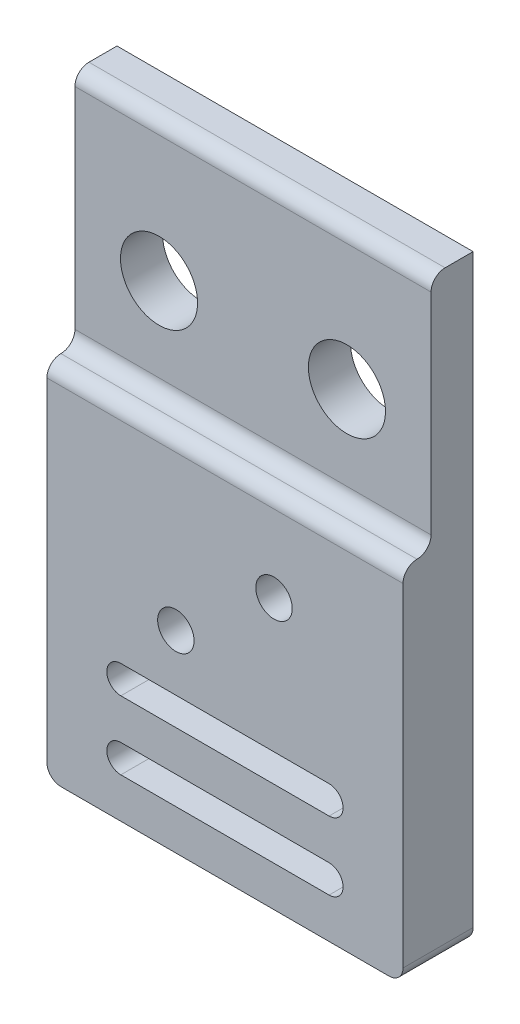
ISO-10303-21;
HEADER;
FILE_DESCRIPTION(('STEP AP214'),'2;1');
FILE_NAME('part.step','',(''),(''),'','','');
FILE_SCHEMA(('AUTOMOTIVE_DESIGN { 1 0 10303 214 1 1 1 1 }'));
ENDSEC;
DATA;
#1=APPLICATION_CONTEXT('core data for automotive mechanical design processes');
#2=APPLICATION_PROTOCOL_DEFINITION('international standard','automotive_design',2000,#1);
#3=PRODUCT_CONTEXT('',#1,'mechanical');
#4=PRODUCT('Part','Part','',(#3));
#5=PRODUCT_RELATED_PRODUCT_CATEGORY('part','',(#4));
#6=PRODUCT_DEFINITION_FORMATION('','',#4);
#7=PRODUCT_DEFINITION_CONTEXT('part definition',#1,'design');
#8=PRODUCT_DEFINITION('design','',#6,#7);
#9=PRODUCT_DEFINITION_SHAPE('','',#8);
#10=(LENGTH_UNIT() NAMED_UNIT(*) SI_UNIT(.MILLI.,.METRE.));
#11=(NAMED_UNIT(*) PLANE_ANGLE_UNIT() SI_UNIT($,.RADIAN.));
#12=(NAMED_UNIT(*) SI_UNIT($,.STERADIAN.) SOLID_ANGLE_UNIT());
#13=UNCERTAINTY_MEASURE_WITH_UNIT(LENGTH_MEASURE(1.E-05),#10,'distance_accuracy_value','');
#14=(GEOMETRIC_REPRESENTATION_CONTEXT(3) GLOBAL_UNCERTAINTY_ASSIGNED_CONTEXT((#13)) GLOBAL_UNIT_ASSIGNED_CONTEXT((#10,
#11,#12)) REPRESENTATION_CONTEXT('',''));
#15=CARTESIAN_POINT('',(0.,0.,0.));
#16=DIRECTION('',(0.,0.,1.));
#17=DIRECTION('',(1.,0.,0.));
#18=AXIS2_PLACEMENT_3D('',#15,#16,#17);
#19=CARTESIAN_POINT('',(0.,0.,3.));
#20=DIRECTION('',(0.,0.,-1.));
#21=DIRECTION('',(-1.,0.,0.));
#22=AXIS2_PLACEMENT_3D('',#19,#20,#21);
#23=PLANE('',#22);
#24=CARTESIAN_POINT('',(-6.7,0.,3.));
#25=DIRECTION('',(0.,0.,1.));
#26=DIRECTION('',(-1.,0.,0.));
#27=AXIS2_PLACEMENT_3D('',#24,#25,#26);
#28=CIRCLE('',#27,2.75);
#29=CARTESIAN_POINT('',(-9.45,0.,3.));
#30=VERTEX_POINT('',#29);
#31=EDGE_CURVE('E257',#30,#30,#28,.T.);
#32=ORIENTED_EDGE('',*,*,#31,.F.);
#33=EDGE_LOOP('',(#32));
#34=FACE_BOUND('',#33,.T.);
#35=CARTESIAN_POINT('',(6.7,0.,3.));
#36=DIRECTION('',(0.,0.,1.));
#37=DIRECTION('',(1.,0.,0.));
#38=AXIS2_PLACEMENT_3D('',#35,#36,#37);
#39=CIRCLE('',#38,2.75);
#40=CARTESIAN_POINT('',(9.45,0.,3.));
#41=VERTEX_POINT('',#40);
#42=EDGE_CURVE('E263',#41,#41,#39,.T.);
#43=ORIENTED_EDGE('',*,*,#42,.F.);
#44=EDGE_LOOP('',(#43));
#45=FACE_BOUND('',#44,.T.);
#46=DIRECTION('',(0.,1.,0.));
#47=VECTOR('',#46,1.);
#48=CARTESIAN_POINT('',(12.7,-10.,3.));
#49=LINE('',#48,#47);
#50=CARTESIAN_POINT('',(12.7,-6.,3.));
#51=VERTEX_POINT('',#50);
#52=CARTESIAN_POINT('',(12.7,9.,3.));
#53=VERTEX_POINT('',#52);
#54=EDGE_CURVE('E269',#51,#53,#49,.T.);
#55=ORIENTED_EDGE('',*,*,#54,.T.);
#56=DIRECTION('',(-1.,0.,0.));
#57=VECTOR('',#56,1.);
#58=CARTESIAN_POINT('',(0.,9.,3.));
#59=LINE('',#58,#57);
#60=CARTESIAN_POINT('',(-12.7,9.,3.));
#61=VERTEX_POINT('',#60);
#62=EDGE_CURVE('E372',#53,#61,#59,.T.);
#63=ORIENTED_EDGE('',*,*,#62,.T.);
#64=DIRECTION('',(0.,-1.,0.));
#65=VECTOR('',#64,1.);
#66=CARTESIAN_POINT('',(-12.7,-10.,3.));
#67=LINE('',#66,#65);
#68=CARTESIAN_POINT('',(-12.7,-6.,3.));
#69=VERTEX_POINT('',#68);
#70=EDGE_CURVE('E272',#61,#69,#67,.T.);
#71=ORIENTED_EDGE('',*,*,#70,.T.);
#72=DIRECTION('',(-1.,0.,0.));
#73=VECTOR('',#72,1.);
#74=CARTESIAN_POINT('',(12.7,-6.,3.));
#75=LINE('',#74,#73);
#76=EDGE_CURVE('E370',#69,#51,#75,.F.);
#77=ORIENTED_EDGE('',*,*,#76,.T.);
#78=EDGE_LOOP('',(#55,#63,#71,#77));
#79=FACE_BOUND('',#78,.T.);
#80=ADVANCED_FACE('F32',(#34,#45,#79),#23,.F.);
#81=CARTESIAN_POINT('',(0.,0.,0.));
#82=DIRECTION('',(0.,0.,-1.));
#83=DIRECTION('',(-1.,0.,0.));
#84=AXIS2_PLACEMENT_3D('',#81,#82,#83);
#85=PLANE('',#84);
#86=DIRECTION('',(1.,0.,0.));
#87=VECTOR('',#86,1.);
#88=CARTESIAN_POINT('',(0.,-30.8808034620421,0.));
#89=LINE('',#88,#87);
#90=CARTESIAN_POINT('',(-7.42600909266542,-30.8808034620421,0.));
#91=VERTEX_POINT('',#90);
#92=CARTESIAN_POINT('',(7.42600909266543,-30.8808034620421,0.));
#93=VERTEX_POINT('',#92);
#94=EDGE_CURVE('E299',#91,#93,#89,.T.);
#95=ORIENTED_EDGE('',*,*,#94,.T.);
#96=CARTESIAN_POINT('',(7.42600909266543,-28.8808034620421,0.));
#97=DIRECTION('',(0.,0.,-1.));
#98=DIRECTION('',(-1.,0.,0.));
#99=AXIS2_PLACEMENT_3D('',#96,#97,#98);
#100=CIRCLE('',#99,2.00000000000001);
#101=CARTESIAN_POINT('',(7.42600909266543,-26.8808034620421,0.));
#102=VERTEX_POINT('',#101);
#103=EDGE_CURVE('E301',#93,#102,#100,.F.);
#104=ORIENTED_EDGE('',*,*,#103,.T.);
#105=DIRECTION('',(-1.,0.,0.));
#106=VECTOR('',#105,1.);
#107=CARTESIAN_POINT('',(0.,-26.8808034620421,0.));
#108=LINE('',#107,#106);
#109=CARTESIAN_POINT('',(-7.42600909266542,-26.8808034620421,0.));
#110=VERTEX_POINT('',#109);
#111=EDGE_CURVE('E295',#102,#110,#108,.T.);
#112=ORIENTED_EDGE('',*,*,#111,.T.);
#113=CARTESIAN_POINT('',(-7.42600909266542,-28.8808034620421,0.));
#114=DIRECTION('',(0.,0.,-1.));
#115=DIRECTION('',(-1.,0.,0.));
#116=AXIS2_PLACEMENT_3D('',#113,#114,#115);
#117=CIRCLE('',#116,2.00000000000001);
#118=EDGE_CURVE('E297',#110,#91,#117,.F.);
#119=ORIENTED_EDGE('',*,*,#118,.T.);
#120=EDGE_LOOP('',(#95,#104,#112,#119));
#121=FACE_BOUND('',#120,.T.);
#122=DIRECTION('',(-1.,0.,0.));
#123=VECTOR('',#122,1.);
#124=CARTESIAN_POINT('',(0.,-22.,0.));
#125=LINE('',#124,#123);
#126=CARTESIAN_POINT('',(7.42600909266543,-22.,0.));
#127=VERTEX_POINT('',#126);
#128=CARTESIAN_POINT('',(-7.42600909266543,-22.,0.));
#129=VERTEX_POINT('',#128);
#130=EDGE_CURVE('E290',#127,#129,#125,.T.);
#131=ORIENTED_EDGE('',*,*,#130,.T.);
#132=CARTESIAN_POINT('',(-7.42600909266543,-24.,0.));
#133=DIRECTION('',(0.,0.,-1.));
#134=DIRECTION('',(-1.,0.,0.));
#135=AXIS2_PLACEMENT_3D('',#132,#133,#134);
#136=CIRCLE('',#135,2.);
#137=CARTESIAN_POINT('',(-7.42600909266543,-26.,0.));
#138=VERTEX_POINT('',#137);
#139=EDGE_CURVE('E292',#129,#138,#136,.F.);
#140=ORIENTED_EDGE('',*,*,#139,.T.);
#141=DIRECTION('',(1.,0.,0.));
#142=VECTOR('',#141,1.);
#143=CARTESIAN_POINT('',(0.,-26.,0.));
#144=LINE('',#143,#142);
#145=CARTESIAN_POINT('',(7.42600909266543,-26.,0.));
#146=VERTEX_POINT('',#145);
#147=EDGE_CURVE('E286',#138,#146,#144,.T.);
#148=ORIENTED_EDGE('',*,*,#147,.T.);
#149=CARTESIAN_POINT('',(7.42600909266543,-24.,0.));
#150=DIRECTION('',(0.,0.,-1.));
#151=DIRECTION('',(-1.,0.,0.));
#152=AXIS2_PLACEMENT_3D('',#149,#150,#151);
#153=CIRCLE('',#152,2.);
#154=EDGE_CURVE('E288',#146,#127,#153,.F.);
#155=ORIENTED_EDGE('',*,*,#154,.T.);
#156=EDGE_LOOP('',(#131,#140,#148,#155));
#157=FACE_BOUND('',#156,.T.);
#158=DIRECTION('',(0.,1.,0.));
#159=VECTOR('',#158,1.);
#160=CARTESIAN_POINT('',(12.7,-10.,0.));
#161=LINE('',#160,#159);
#162=CARTESIAN_POINT('',(12.7,-31.75,0.));
#163=VERTEX_POINT('',#162);
#164=CARTESIAN_POINT('',(12.7,10.,0.));
#165=VERTEX_POINT('',#164);
#166=EDGE_CURVE('E266',#163,#165,#161,.T.);
#167=ORIENTED_EDGE('',*,*,#166,.F.);
#168=CARTESIAN_POINT('',(11.7,-31.75,0.));
#169=DIRECTION('',(0.,0.,-1.));
#170=DIRECTION('',(-1.,0.,0.));
#171=AXIS2_PLACEMENT_3D('',#168,#169,#170);
#172=CIRCLE('',#171,1.);
#173=CARTESIAN_POINT('',(11.7,-32.75,0.));
#174=VERTEX_POINT('',#173);
#175=EDGE_CURVE('E351',#163,#174,#172,.T.);
#176=ORIENTED_EDGE('',*,*,#175,.T.);
#177=DIRECTION('',(1.,0.,0.));
#178=VECTOR('',#177,1.);
#179=CARTESIAN_POINT('',(-12.7,-32.75,0.));
#180=LINE('',#179,#178);
#181=CARTESIAN_POINT('',(-11.7,-32.75,0.));
#182=VERTEX_POINT('',#181);
#183=EDGE_CURVE('E242',#182,#174,#180,.T.);
#184=ORIENTED_EDGE('',*,*,#183,.F.);
#185=CARTESIAN_POINT('',(-11.7,-31.75,0.));
#186=DIRECTION('',(0.,0.,-1.));
#187=DIRECTION('',(-1.,0.,0.));
#188=AXIS2_PLACEMENT_3D('',#185,#186,#187);
#189=CIRCLE('',#188,1.);
#190=CARTESIAN_POINT('',(-12.7,-31.75,0.));
#191=VERTEX_POINT('',#190);
#192=EDGE_CURVE('E349',#182,#191,#189,.T.);
#193=ORIENTED_EDGE('',*,*,#192,.T.);
#194=DIRECTION('',(0.,-1.,0.));
#195=VECTOR('',#194,1.);
#196=CARTESIAN_POINT('',(-12.7,-10.,0.));
#197=LINE('',#196,#195);
#198=CARTESIAN_POINT('',(-12.7,10.,0.));
#199=VERTEX_POINT('',#198);
#200=EDGE_CURVE('E273',#199,#191,#197,.T.);
#201=ORIENTED_EDGE('',*,*,#200,.F.);
#202=DIRECTION('',(-1.,0.,0.));
#203=VECTOR('',#202,1.);
#204=CARTESIAN_POINT('',(-12.7,10.,0.));
#205=LINE('',#204,#203);
#206=EDGE_CURVE('E278',#165,#199,#205,.T.);
#207=ORIENTED_EDGE('',*,*,#206,.F.);
#208=EDGE_LOOP('',(#167,#176,#184,#193,#201,#207));
#209=FACE_BOUND('',#208,.T.);
#210=CARTESIAN_POINT('',(-3.5,-19.,0.));
#211=DIRECTION('',(0.,0.,1.));
#212=DIRECTION('',(1.,0.,0.));
#213=AXIS2_PLACEMENT_3D('',#210,#211,#212);
#214=CIRCLE('',#213,1.3);
#215=CARTESIAN_POINT('',(-2.2,-19.,0.));
#216=VERTEX_POINT('',#215);
#217=EDGE_CURVE('E238',#216,#216,#214,.T.);
#218=ORIENTED_EDGE('',*,*,#217,.T.);
#219=EDGE_LOOP('',(#218));
#220=FACE_BOUND('',#219,.T.);
#221=CARTESIAN_POINT('',(3.5,-13.5,0.));
#222=DIRECTION('',(0.,0.,1.));
#223=DIRECTION('',(1.,0.,0.));
#224=AXIS2_PLACEMENT_3D('',#221,#222,#223);
#225=CIRCLE('',#224,1.3);
#226=CARTESIAN_POINT('',(4.8,-13.5,0.));
#227=VERTEX_POINT('',#226);
#228=EDGE_CURVE('E333',#227,#227,#225,.T.);
#229=ORIENTED_EDGE('',*,*,#228,.T.);
#230=EDGE_LOOP('',(#229));
#231=FACE_BOUND('',#230,.T.);
#232=CARTESIAN_POINT('',(6.7,0.,0.));
#233=DIRECTION('',(0.,0.,1.));
#234=DIRECTION('',(1.,0.,0.));
#235=AXIS2_PLACEMENT_3D('',#232,#233,#234);
#236=CIRCLE('',#235,2.75);
#237=CARTESIAN_POINT('',(9.45,0.,0.));
#238=VERTEX_POINT('',#237);
#239=EDGE_CURVE('E260',#238,#238,#236,.T.);
#240=ORIENTED_EDGE('',*,*,#239,.T.);
#241=EDGE_LOOP('',(#240));
#242=FACE_BOUND('',#241,.T.);
#243=CARTESIAN_POINT('',(-6.7,0.,0.));
#244=DIRECTION('',(0.,0.,1.));
#245=DIRECTION('',(-1.,0.,0.));
#246=AXIS2_PLACEMENT_3D('',#243,#244,#245);
#247=CIRCLE('',#246,2.75);
#248=CARTESIAN_POINT('',(-9.45,0.,0.));
#249=VERTEX_POINT('',#248);
#250=EDGE_CURVE('E254',#249,#249,#247,.T.);
#251=ORIENTED_EDGE('',*,*,#250,.T.);
#252=EDGE_LOOP('',(#251));
#253=FACE_BOUND('',#252,.T.);
#254=ADVANCED_FACE('F409',(#121,#157,#209,#220,#231,#242,#253),#85,.T.);
#255=CARTESIAN_POINT('',(12.7,-10.,3.));
#256=DIRECTION('',(-1.,0.,0.));
#257=DIRECTION('',(0.,0.,1.));
#258=AXIS2_PLACEMENT_3D('',#255,#256,#257);
#259=PLANE('',#258);
#260=DIRECTION('',(0.,1.,0.));
#261=VECTOR('',#260,1.);
#262=CARTESIAN_POINT('',(12.7,-7.,5.));
#263=LINE('',#262,#261);
#264=CARTESIAN_POINT('',(12.7,-31.75,5.));
#265=VERTEX_POINT('',#264);
#266=CARTESIAN_POINT('',(12.7,-8.,5.));
#267=VERTEX_POINT('',#266);
#268=EDGE_CURVE('E251',#265,#267,#263,.T.);
#269=ORIENTED_EDGE('',*,*,#268,.F.);
#270=DIRECTION('',(0.,0.,-1.));
#271=VECTOR('',#270,1.);
#272=CARTESIAN_POINT('',(12.7,-31.75,3.));
#273=LINE('',#272,#271);
#274=EDGE_CURVE('E346',#265,#163,#273,.T.);
#275=ORIENTED_EDGE('',*,*,#274,.T.);
#276=ORIENTED_EDGE('',*,*,#166,.T.);
#277=DIRECTION('',(0.,0.,-1.));
#278=VECTOR('',#277,1.);
#279=CARTESIAN_POINT('',(12.7,10.,3.));
#280=LINE('',#279,#278);
#281=CARTESIAN_POINT('',(12.7,10.,2.));
#282=VERTEX_POINT('',#281);
#283=EDGE_CURVE('E284',#282,#165,#280,.T.);
#284=ORIENTED_EDGE('',*,*,#283,.F.);
#285=CARTESIAN_POINT('',(12.7,9.,2.));
#286=DIRECTION('',(-1.,0.,0.));
#287=DIRECTION('',(0.,0.,1.));
#288=AXIS2_PLACEMENT_3D('',#285,#286,#287);
#289=CIRCLE('',#288,1.);
#290=EDGE_CURVE('E344',#282,#53,#289,.F.);
#291=ORIENTED_EDGE('',*,*,#290,.T.);
#292=ORIENTED_EDGE('',*,*,#54,.F.);
#293=CARTESIAN_POINT('',(12.7,-6.,4.));
#294=DIRECTION('',(-1.,0.,0.));
#295=DIRECTION('',(0.,0.,1.));
#296=AXIS2_PLACEMENT_3D('',#293,#294,#295);
#297=CIRCLE('',#296,1.);
#298=CARTESIAN_POINT('',(12.7,-7.,4.));
#299=VERTEX_POINT('',#298);
#300=EDGE_CURVE('E11',#51,#299,#297,.T.);
#301=ORIENTED_EDGE('',*,*,#300,.T.);
#302=CARTESIAN_POINT('',(12.7,-8.,4.));
#303=DIRECTION('',(-1.,0.,0.));
#304=DIRECTION('',(0.,0.,1.));
#305=AXIS2_PLACEMENT_3D('',#302,#303,#304);
#306=CIRCLE('',#305,1.);
#307=EDGE_CURVE('E321',#299,#267,#306,.F.);
#308=ORIENTED_EDGE('',*,*,#307,.T.);
#309=EDGE_LOOP('',(#269,#275,#276,#284,#291,#292,#301,#308));
#310=FACE_BOUND('',#309,.T.);
#311=ADVANCED_FACE('F385',(#310),#259,.F.);
#312=CARTESIAN_POINT('',(-12.7,10.,3.));
#313=DIRECTION('',(0.,-1.,0.));
#314=DIRECTION('',(0.,0.,-1.));
#315=AXIS2_PLACEMENT_3D('',#312,#313,#314);
#316=PLANE('',#315);
#317=DIRECTION('',(0.,0.,-1.));
#318=VECTOR('',#317,1.);
#319=CARTESIAN_POINT('',(-12.7,10.,3.));
#320=LINE('',#319,#318);
#321=CARTESIAN_POINT('',(-12.7,10.,2.));
#322=VERTEX_POINT('',#321);
#323=EDGE_CURVE('E275',#322,#199,#320,.T.);
#324=ORIENTED_EDGE('',*,*,#323,.F.);
#325=DIRECTION('',(-1.,0.,0.));
#326=VECTOR('',#325,1.);
#327=CARTESIAN_POINT('',(-12.7,10.,2.));
#328=LINE('',#327,#326);
#329=EDGE_CURVE('E375',#322,#282,#328,.F.);
#330=ORIENTED_EDGE('',*,*,#329,.T.);
#331=ORIENTED_EDGE('',*,*,#283,.T.);
#332=ORIENTED_EDGE('',*,*,#206,.T.);
#333=EDGE_LOOP('',(#324,#330,#331,#332));
#334=FACE_BOUND('',#333,.T.);
#335=ADVANCED_FACE('F380',(#334),#316,.F.);
#336=CARTESIAN_POINT('',(-12.7,-10.,3.));
#337=DIRECTION('',(1.,0.,0.));
#338=DIRECTION('',(0.,0.,-1.));
#339=AXIS2_PLACEMENT_3D('',#336,#337,#338);
#340=PLANE('',#339);
#341=ORIENTED_EDGE('',*,*,#200,.T.);
#342=DIRECTION('',(0.,0.,-1.));
#343=VECTOR('',#342,1.);
#344=CARTESIAN_POINT('',(-12.7,-31.75,3.));
#345=LINE('',#344,#343);
#346=CARTESIAN_POINT('',(-12.7,-31.75,5.));
#347=VERTEX_POINT('',#346);
#348=EDGE_CURVE('E368',#191,#347,#345,.F.);
#349=ORIENTED_EDGE('',*,*,#348,.T.);
#350=DIRECTION('',(0.,-1.,0.));
#351=VECTOR('',#350,1.);
#352=CARTESIAN_POINT('',(-12.7,-7.,5.));
#353=LINE('',#352,#351);
#354=CARTESIAN_POINT('',(-12.7,-8.,5.));
#355=VERTEX_POINT('',#354);
#356=EDGE_CURVE('E245',#355,#347,#353,.T.);
#357=ORIENTED_EDGE('',*,*,#356,.F.);
#358=CARTESIAN_POINT('',(-12.7,-8.,4.));
#359=DIRECTION('',(1.,0.,0.));
#360=DIRECTION('',(0.,0.,-1.));
#361=AXIS2_PLACEMENT_3D('',#358,#359,#360);
#362=CIRCLE('',#361,1.);
#363=CARTESIAN_POINT('',(-12.7,-7.,4.));
#364=VERTEX_POINT('',#363);
#365=EDGE_CURVE('E365',#355,#364,#362,.F.);
#366=ORIENTED_EDGE('',*,*,#365,.T.);
#367=CARTESIAN_POINT('',(-12.7,-6.,4.));
#368=DIRECTION('',(1.,0.,0.));
#369=DIRECTION('',(0.,0.,-1.));
#370=AXIS2_PLACEMENT_3D('',#367,#368,#369);
#371=CIRCLE('',#370,1.);
#372=EDGE_CURVE('E41',#364,#69,#371,.T.);
#373=ORIENTED_EDGE('',*,*,#372,.T.);
#374=ORIENTED_EDGE('',*,*,#70,.F.);
#375=CARTESIAN_POINT('',(-12.7,9.,2.));
#376=DIRECTION('',(1.,0.,0.));
#377=DIRECTION('',(0.,0.,-1.));
#378=AXIS2_PLACEMENT_3D('',#375,#376,#377);
#379=CIRCLE('',#378,1.);
#380=EDGE_CURVE('E48',#61,#322,#379,.F.);
#381=ORIENTED_EDGE('',*,*,#380,.T.);
#382=ORIENTED_EDGE('',*,*,#323,.T.);
#383=EDGE_LOOP('',(#341,#349,#357,#366,#373,#374,#381,#382));
#384=FACE_BOUND('',#383,.T.);
#385=ADVANCED_FACE('F393',(#384),#340,.F.);
#386=CARTESIAN_POINT('',(6.7,0.,3.));
#387=DIRECTION('',(0.,0.,-1.));
#388=DIRECTION('',(-1.,0.,0.));
#389=AXIS2_PLACEMENT_3D('',#386,#387,#388);
#390=CYLINDRICAL_SURFACE('',#389,2.75);
#391=ORIENTED_EDGE('',*,*,#42,.T.);
#392=EDGE_LOOP('',(#391));
#393=FACE_BOUND('',#392,.T.);
#394=ORIENTED_EDGE('',*,*,#239,.F.);
#395=EDGE_LOOP('',(#394));
#396=FACE_BOUND('',#395,.T.);
#397=ADVANCED_FACE('F397',(#393,#396),#390,.F.);
#398=CARTESIAN_POINT('',(-6.7,0.,3.));
#399=DIRECTION('',(0.,0.,-1.));
#400=DIRECTION('',(-1.,0.,0.));
#401=AXIS2_PLACEMENT_3D('',#398,#399,#400);
#402=CYLINDRICAL_SURFACE('',#401,2.75);
#403=ORIENTED_EDGE('',*,*,#31,.T.);
#404=EDGE_LOOP('',(#403));
#405=FACE_BOUND('',#404,.T.);
#406=ORIENTED_EDGE('',*,*,#250,.F.);
#407=EDGE_LOOP('',(#406));
#408=FACE_BOUND('',#407,.T.);
#409=ADVANCED_FACE('F403',(#405,#408),#402,.F.);
#410=CARTESIAN_POINT('',(0.,0.,5.));
#411=DIRECTION('',(0.,0.,1.));
#412=DIRECTION('',(1.,0.,0.));
#413=AXIS2_PLACEMENT_3D('',#410,#411,#412);
#414=PLANE('',#413);
#415=DIRECTION('',(1.,0.,0.));
#416=VECTOR('',#415,1.);
#417=CARTESIAN_POINT('',(-7.42600909266542,-29.8808034620421,5.));
#418=LINE('',#417,#416);
#419=CARTESIAN_POINT('',(-7.42600909266542,-29.8808034620421,5.));
#420=VERTEX_POINT('',#419);
#421=CARTESIAN_POINT('',(7.42600909266543,-29.8808034620421,5.));
#422=VERTEX_POINT('',#421);
#423=EDGE_CURVE('E190',#420,#422,#418,.T.);
#424=ORIENTED_EDGE('',*,*,#423,.F.);
#425=CARTESIAN_POINT('',(-7.42600909266542,-28.8808034620421,5.));
#426=DIRECTION('',(0.,0.,1.));
#427=DIRECTION('',(-1.,0.,0.));
#428=AXIS2_PLACEMENT_3D('',#425,#426,#427);
#429=CIRCLE('',#428,1.00000000000001);
#430=CARTESIAN_POINT('',(-7.42600909266542,-27.8808034620421,5.));
#431=VERTEX_POINT('',#430);
#432=EDGE_CURVE('E180',#431,#420,#429,.T.);
#433=ORIENTED_EDGE('',*,*,#432,.F.);
#434=DIRECTION('',(-1.,0.,0.));
#435=VECTOR('',#434,1.);
#436=CARTESIAN_POINT('',(-7.42600909266542,-27.8808034620421,5.));
#437=LINE('',#436,#435);
#438=CARTESIAN_POINT('',(7.42600909266543,-27.8808034620421,5.));
#439=VERTEX_POINT('',#438);
#440=EDGE_CURVE('E208',#439,#431,#437,.T.);
#441=ORIENTED_EDGE('',*,*,#440,.F.);
#442=CARTESIAN_POINT('',(7.42600909266543,-28.8808034620421,5.));
#443=DIRECTION('',(0.,0.,1.));
#444=DIRECTION('',(-1.,0.,0.));
#445=AXIS2_PLACEMENT_3D('',#442,#443,#444);
#446=CIRCLE('',#445,1.00000000000001);
#447=EDGE_CURVE('E206',#422,#439,#446,.T.);
#448=ORIENTED_EDGE('',*,*,#447,.F.);
#449=EDGE_LOOP('',(#424,#433,#441,#448));
#450=FACE_BOUND('',#449,.T.);
#451=DIRECTION('',(1.,0.,0.));
#452=VECTOR('',#451,1.);
#453=CARTESIAN_POINT('',(-7.42600909266543,-25.,5.));
#454=LINE('',#453,#452);
#455=CARTESIAN_POINT('',(-7.42600909266543,-25.,5.));
#456=VERTEX_POINT('',#455);
#457=CARTESIAN_POINT('',(7.42600909266543,-25.,5.));
#458=VERTEX_POINT('',#457);
#459=EDGE_CURVE('E219',#456,#458,#454,.T.);
#460=ORIENTED_EDGE('',*,*,#459,.F.);
#461=CARTESIAN_POINT('',(-7.42600909266543,-24.,5.));
#462=DIRECTION('',(0.,0.,1.));
#463=DIRECTION('',(1.,0.,0.));
#464=AXIS2_PLACEMENT_3D('',#461,#462,#463);
#465=CIRCLE('',#464,1.);
#466=CARTESIAN_POINT('',(-7.42600909266543,-23.,5.));
#467=VERTEX_POINT('',#466);
#468=EDGE_CURVE('E199',#467,#456,#465,.T.);
#469=ORIENTED_EDGE('',*,*,#468,.F.);
#470=DIRECTION('',(-1.,0.,0.));
#471=VECTOR('',#470,1.);
#472=CARTESIAN_POINT('',(-7.42600909266543,-23.,5.));
#473=LINE('',#472,#471);
#474=CARTESIAN_POINT('',(7.42600909266543,-23.,5.));
#475=VERTEX_POINT('',#474);
#476=EDGE_CURVE('E224',#475,#467,#473,.T.);
#477=ORIENTED_EDGE('',*,*,#476,.F.);
#478=CARTESIAN_POINT('',(7.42600909266543,-24.,5.));
#479=DIRECTION('',(0.,0.,1.));
#480=DIRECTION('',(1.,0.,0.));
#481=AXIS2_PLACEMENT_3D('',#478,#479,#480);
#482=CIRCLE('',#481,1.);
#483=EDGE_CURVE('E221',#458,#475,#482,.T.);
#484=ORIENTED_EDGE('',*,*,#483,.F.);
#485=EDGE_LOOP('',(#460,#469,#477,#484));
#486=FACE_BOUND('',#485,.T.);
#487=CARTESIAN_POINT('',(-3.5,-19.,5.));
#488=DIRECTION('',(0.,0.,1.));
#489=DIRECTION('',(1.,0.,0.));
#490=AXIS2_PLACEMENT_3D('',#487,#488,#489);
#491=CIRCLE('',#490,1.3);
#492=CARTESIAN_POINT('',(-2.2,-19.,5.));
#493=VERTEX_POINT('',#492);
#494=EDGE_CURVE('E239',#493,#493,#491,.T.);
#495=ORIENTED_EDGE('',*,*,#494,.F.);
#496=EDGE_LOOP('',(#495));
#497=FACE_BOUND('',#496,.T.);
#498=DIRECTION('',(1.,0.,0.));
#499=VECTOR('',#498,1.);
#500=CARTESIAN_POINT('',(-12.7,-32.75,5.));
#501=LINE('',#500,#499);
#502=CARTESIAN_POINT('',(-11.7,-32.75,5.));
#503=VERTEX_POINT('',#502);
#504=CARTESIAN_POINT('',(11.7,-32.75,5.));
#505=VERTEX_POINT('',#504);
#506=EDGE_CURVE('E248',#503,#505,#501,.T.);
#507=ORIENTED_EDGE('',*,*,#506,.T.);
#508=CARTESIAN_POINT('',(11.7,-31.75,5.));
#509=DIRECTION('',(0.,0.,1.));
#510=DIRECTION('',(1.,0.,0.));
#511=AXIS2_PLACEMENT_3D('',#508,#509,#510);
#512=CIRCLE('',#511,1.);
#513=EDGE_CURVE('E363',#505,#265,#512,.T.);
#514=ORIENTED_EDGE('',*,*,#513,.T.);
#515=ORIENTED_EDGE('',*,*,#268,.T.);
#516=DIRECTION('',(-1.,0.,0.));
#517=VECTOR('',#516,1.);
#518=CARTESIAN_POINT('',(-12.7,-8.,5.));
#519=LINE('',#518,#517);
#520=EDGE_CURVE('E358',#267,#355,#519,.T.);
#521=ORIENTED_EDGE('',*,*,#520,.T.);
#522=ORIENTED_EDGE('',*,*,#356,.T.);
#523=CARTESIAN_POINT('',(-11.7,-31.75,5.));
#524=DIRECTION('',(0.,0.,1.));
#525=DIRECTION('',(1.,0.,0.));
#526=AXIS2_PLACEMENT_3D('',#523,#524,#525);
#527=CIRCLE('',#526,1.);
#528=EDGE_CURVE('E361',#347,#503,#527,.T.);
#529=ORIENTED_EDGE('',*,*,#528,.T.);
#530=EDGE_LOOP('',(#507,#514,#515,#521,#522,#529));
#531=FACE_BOUND('',#530,.T.);
#532=CARTESIAN_POINT('',(3.5,-13.5,5.));
#533=DIRECTION('',(0.,0.,1.));
#534=DIRECTION('',(1.,0.,0.));
#535=AXIS2_PLACEMENT_3D('',#532,#533,#534);
#536=CIRCLE('',#535,1.3);
#537=CARTESIAN_POINT('',(4.8,-13.5,5.));
#538=VERTEX_POINT('',#537);
#539=EDGE_CURVE('E191',#538,#538,#536,.T.);
#540=ORIENTED_EDGE('',*,*,#539,.F.);
#541=EDGE_LOOP('',(#540));
#542=FACE_BOUND('',#541,.T.);
#543=ADVANCED_FACE('F203',(#450,#486,#497,#531,#542),#414,.T.);
#544=CARTESIAN_POINT('',(-12.7,-32.75,5.));
#545=DIRECTION('',(0.,1.,0.));
#546=DIRECTION('',(0.,0.,1.));
#547=AXIS2_PLACEMENT_3D('',#544,#545,#546);
#548=PLANE('',#547);
#549=ORIENTED_EDGE('',*,*,#183,.T.);
#550=DIRECTION('',(0.,0.,-1.));
#551=VECTOR('',#550,1.);
#552=CARTESIAN_POINT('',(11.7,-32.75,5.));
#553=LINE('',#552,#551);
#554=EDGE_CURVE('E356',#174,#505,#553,.F.);
#555=ORIENTED_EDGE('',*,*,#554,.T.);
#556=ORIENTED_EDGE('',*,*,#506,.F.);
#557=DIRECTION('',(0.,0.,-1.));
#558=VECTOR('',#557,1.);
#559=CARTESIAN_POINT('',(-11.7,-32.75,5.));
#560=LINE('',#559,#558);
#561=EDGE_CURVE('E353',#503,#182,#560,.T.);
#562=ORIENTED_EDGE('',*,*,#561,.T.);
#563=EDGE_LOOP('',(#549,#555,#556,#562));
#564=FACE_BOUND('',#563,.T.);
#565=ADVANCED_FACE('F422',(#564),#548,.F.);
#566=CARTESIAN_POINT('',(-3.5,-19.,5.));
#567=DIRECTION('',(0.,0.,-1.));
#568=DIRECTION('',(-1.,0.,0.));
#569=AXIS2_PLACEMENT_3D('',#566,#567,#568);
#570=CYLINDRICAL_SURFACE('',#569,1.3);
#571=ORIENTED_EDGE('',*,*,#494,.T.);
#572=EDGE_LOOP('',(#571));
#573=FACE_BOUND('',#572,.T.);
#574=ORIENTED_EDGE('',*,*,#217,.F.);
#575=EDGE_LOOP('',(#574));
#576=FACE_BOUND('',#575,.T.);
#577=ADVANCED_FACE('F425',(#573,#576),#570,.F.);
#578=CARTESIAN_POINT('',(-7.42600909266543,-24.,5.));
#579=DIRECTION('',(0.,0.,-1.));
#580=DIRECTION('',(-1.,0.,0.));
#581=AXIS2_PLACEMENT_3D('',#578,#579,#580);
#582=CYLINDRICAL_SURFACE('',#581,1.);
#583=DIRECTION('',(0.,0.,-1.));
#584=VECTOR('',#583,1.);
#585=CARTESIAN_POINT('',(-7.42600909266543,-25.,5.));
#586=LINE('',#585,#584);
#587=CARTESIAN_POINT('',(-7.42600909266543,-25.,1.));
#588=VERTEX_POINT('',#587);
#589=EDGE_CURVE('E235',#456,#588,#586,.T.);
#590=ORIENTED_EDGE('',*,*,#589,.T.);
#591=CARTESIAN_POINT('',(-7.42600909266543,-24.,1.));
#592=DIRECTION('',(0.,0.,-1.));
#593=DIRECTION('',(-1.,0.,0.));
#594=AXIS2_PLACEMENT_3D('',#591,#592,#593);
#595=CIRCLE('',#594,1.);
#596=CARTESIAN_POINT('',(-7.42600909266543,-23.,1.));
#597=VERTEX_POINT('',#596);
#598=EDGE_CURVE('E310',#588,#597,#595,.T.);
#599=ORIENTED_EDGE('',*,*,#598,.T.);
#600=DIRECTION('',(0.,0.,-1.));
#601=VECTOR('',#600,1.);
#602=CARTESIAN_POINT('',(-7.42600909266543,-23.,5.));
#603=LINE('',#602,#601);
#604=EDGE_CURVE('E226',#467,#597,#603,.T.);
#605=ORIENTED_EDGE('',*,*,#604,.F.);
#606=ORIENTED_EDGE('',*,*,#468,.T.);
#607=EDGE_LOOP('',(#590,#599,#605,#606));
#608=FACE_BOUND('',#607,.T.);
#609=ADVANCED_FACE('F431',(#608),#582,.F.);
#610=CARTESIAN_POINT('',(-7.42600909266543,-25.,5.));
#611=DIRECTION('',(0.,1.,0.));
#612=DIRECTION('',(-1.,0.,0.));
#613=AXIS2_PLACEMENT_3D('',#610,#611,#612);
#614=PLANE('',#613);
#615=DIRECTION('',(0.,0.,-1.));
#616=VECTOR('',#615,1.);
#617=CARTESIAN_POINT('',(7.42600909266543,-25.,5.));
#618=LINE('',#617,#616);
#619=CARTESIAN_POINT('',(7.42600909266543,-25.,1.));
#620=VERTEX_POINT('',#619);
#621=EDGE_CURVE('E232',#458,#620,#618,.T.);
#622=ORIENTED_EDGE('',*,*,#621,.T.);
#623=DIRECTION('',(1.,0.,0.));
#624=VECTOR('',#623,1.);
#625=CARTESIAN_POINT('',(-7.42600909266543,-25.,1.));
#626=LINE('',#625,#624);
#627=EDGE_CURVE('E319',#620,#588,#626,.F.);
#628=ORIENTED_EDGE('',*,*,#627,.T.);
#629=ORIENTED_EDGE('',*,*,#589,.F.);
#630=ORIENTED_EDGE('',*,*,#459,.T.);
#631=EDGE_LOOP('',(#622,#628,#629,#630));
#632=FACE_BOUND('',#631,.T.);
#633=ADVANCED_FACE('F435',(#632),#614,.T.);
#634=CARTESIAN_POINT('',(7.42600909266543,-24.,5.));
#635=DIRECTION('',(0.,0.,-1.));
#636=DIRECTION('',(-1.,0.,0.));
#637=AXIS2_PLACEMENT_3D('',#634,#635,#636);
#638=CYLINDRICAL_SURFACE('',#637,1.);
#639=DIRECTION('',(0.,0.,-1.));
#640=VECTOR('',#639,1.);
#641=CARTESIAN_POINT('',(7.42600909266543,-23.,5.));
#642=LINE('',#641,#640);
#643=CARTESIAN_POINT('',(7.42600909266543,-23.,1.));
#644=VERTEX_POINT('',#643);
#645=EDGE_CURVE('E229',#475,#644,#642,.T.);
#646=ORIENTED_EDGE('',*,*,#645,.T.);
#647=CARTESIAN_POINT('',(7.42600909266543,-24.,1.));
#648=DIRECTION('',(0.,0.,-1.));
#649=DIRECTION('',(-1.,0.,0.));
#650=AXIS2_PLACEMENT_3D('',#647,#648,#649);
#651=CIRCLE('',#650,1.);
#652=EDGE_CURVE('E315',#644,#620,#651,.T.);
#653=ORIENTED_EDGE('',*,*,#652,.T.);
#654=ORIENTED_EDGE('',*,*,#621,.F.);
#655=ORIENTED_EDGE('',*,*,#483,.T.);
#656=EDGE_LOOP('',(#646,#653,#654,#655));
#657=FACE_BOUND('',#656,.T.);
#658=ADVANCED_FACE('F439',(#657),#638,.F.);
#659=CARTESIAN_POINT('',(-7.42600909266543,-23.,5.));
#660=DIRECTION('',(0.,-1.,0.));
#661=DIRECTION('',(1.,0.,0.));
#662=AXIS2_PLACEMENT_3D('',#659,#660,#661);
#663=PLANE('',#662);
#664=ORIENTED_EDGE('',*,*,#604,.T.);
#665=DIRECTION('',(-1.,0.,0.));
#666=VECTOR('',#665,1.);
#667=CARTESIAN_POINT('',(-7.42600909266543,-23.,1.));
#668=LINE('',#667,#666);
#669=EDGE_CURVE('E313',#597,#644,#668,.F.);
#670=ORIENTED_EDGE('',*,*,#669,.T.);
#671=ORIENTED_EDGE('',*,*,#645,.F.);
#672=ORIENTED_EDGE('',*,*,#476,.T.);
#673=EDGE_LOOP('',(#664,#670,#671,#672));
#674=FACE_BOUND('',#673,.T.);
#675=ADVANCED_FACE('F443',(#674),#663,.T.);
#676=CARTESIAN_POINT('',(-7.42600909266542,-28.8808034620421,5.));
#677=DIRECTION('',(0.,0.,-1.));
#678=DIRECTION('',(-1.,0.,0.));
#679=AXIS2_PLACEMENT_3D('',#676,#677,#678);
#680=CYLINDRICAL_SURFACE('',#679,1.00000000000001);
#681=DIRECTION('',(0.,0.,-1.));
#682=VECTOR('',#681,1.);
#683=CARTESIAN_POINT('',(-7.42600909266542,-29.8808034620421,5.));
#684=LINE('',#683,#682);
#685=CARTESIAN_POINT('',(-7.42600909266542,-29.8808034620421,1.));
#686=VERTEX_POINT('',#685);
#687=EDGE_CURVE('E183',#420,#686,#684,.T.);
#688=ORIENTED_EDGE('',*,*,#687,.T.);
#689=CARTESIAN_POINT('',(-7.42600909266542,-28.8808034620421,1.));
#690=DIRECTION('',(0.,0.,-1.));
#691=DIRECTION('',(-1.,0.,0.));
#692=AXIS2_PLACEMENT_3D('',#689,#690,#691);
#693=CIRCLE('',#692,1.00000000000001);
#694=CARTESIAN_POINT('',(-7.42600909266542,-27.8808034620421,1.));
#695=VERTEX_POINT('',#694);
#696=EDGE_CURVE('E308',#686,#695,#693,.T.);
#697=ORIENTED_EDGE('',*,*,#696,.T.);
#698=DIRECTION('',(0.,0.,-1.));
#699=VECTOR('',#698,1.);
#700=CARTESIAN_POINT('',(-7.42600909266542,-27.8808034620421,5.));
#701=LINE('',#700,#699);
#702=EDGE_CURVE('E186',#431,#695,#701,.T.);
#703=ORIENTED_EDGE('',*,*,#702,.F.);
#704=ORIENTED_EDGE('',*,*,#432,.T.);
#705=EDGE_LOOP('',(#688,#697,#703,#704));
#706=FACE_BOUND('',#705,.T.);
#707=ADVANCED_FACE('F182',(#706),#680,.F.);
#708=CARTESIAN_POINT('',(-7.42600909266542,-29.8808034620421,5.));
#709=DIRECTION('',(0.,1.,0.));
#710=DIRECTION('',(-1.,0.,0.));
#711=AXIS2_PLACEMENT_3D('',#708,#709,#710);
#712=PLANE('',#711);
#713=DIRECTION('',(0.,0.,-1.));
#714=VECTOR('',#713,1.);
#715=CARTESIAN_POINT('',(7.42600909266543,-29.8808034620421,5.));
#716=LINE('',#715,#714);
#717=CARTESIAN_POINT('',(7.42600909266543,-29.8808034620421,1.));
#718=VERTEX_POINT('',#717);
#719=EDGE_CURVE('E200',#422,#718,#716,.T.);
#720=ORIENTED_EDGE('',*,*,#719,.T.);
#721=DIRECTION('',(1.,0.,0.));
#722=VECTOR('',#721,1.);
#723=CARTESIAN_POINT('',(-7.42600909266542,-29.8808034620421,1.));
#724=LINE('',#723,#722);
#725=EDGE_CURVE('E198',#718,#686,#724,.F.);
#726=ORIENTED_EDGE('',*,*,#725,.T.);
#727=ORIENTED_EDGE('',*,*,#687,.F.);
#728=ORIENTED_EDGE('',*,*,#423,.T.);
#729=EDGE_LOOP('',(#720,#726,#727,#728));
#730=FACE_BOUND('',#729,.T.);
#731=ADVANCED_FACE('F195',(#730),#712,.T.);
#732=CARTESIAN_POINT('',(7.42600909266543,-28.8808034620421,5.));
#733=DIRECTION('',(0.,0.,-1.));
#734=DIRECTION('',(-1.,0.,0.));
#735=AXIS2_PLACEMENT_3D('',#732,#733,#734);
#736=CYLINDRICAL_SURFACE('',#735,1.00000000000001);
#737=DIRECTION('',(0.,0.,-1.));
#738=VECTOR('',#737,1.);
#739=CARTESIAN_POINT('',(7.42600909266543,-27.8808034620421,5.));
#740=LINE('',#739,#738);
#741=CARTESIAN_POINT('',(7.42600909266543,-27.8808034620421,1.));
#742=VERTEX_POINT('',#741);
#743=EDGE_CURVE('E214',#439,#742,#740,.T.);
#744=ORIENTED_EDGE('',*,*,#743,.T.);
#745=CARTESIAN_POINT('',(7.42600909266543,-28.8808034620421,1.));
#746=DIRECTION('',(0.,0.,-1.));
#747=DIRECTION('',(-1.,0.,0.));
#748=AXIS2_PLACEMENT_3D('',#745,#746,#747);
#749=CIRCLE('',#748,1.00000000000001);
#750=EDGE_CURVE('E304',#742,#718,#749,.T.);
#751=ORIENTED_EDGE('',*,*,#750,.T.);
#752=ORIENTED_EDGE('',*,*,#719,.F.);
#753=ORIENTED_EDGE('',*,*,#447,.T.);
#754=EDGE_LOOP('',(#744,#751,#752,#753));
#755=FACE_BOUND('',#754,.T.);
#756=ADVANCED_FACE('F452',(#755),#736,.F.);
#757=CARTESIAN_POINT('',(-7.42600909266542,-27.8808034620421,5.));
#758=DIRECTION('',(0.,-1.,0.));
#759=DIRECTION('',(1.,0.,0.));
#760=AXIS2_PLACEMENT_3D('',#757,#758,#759);
#761=PLANE('',#760);
#762=ORIENTED_EDGE('',*,*,#702,.T.);
#763=DIRECTION('',(-1.,0.,0.));
#764=VECTOR('',#763,1.);
#765=CARTESIAN_POINT('',(-7.42600909266542,-27.8808034620421,1.));
#766=LINE('',#765,#764);
#767=EDGE_CURVE('E317',#695,#742,#766,.F.);
#768=ORIENTED_EDGE('',*,*,#767,.T.);
#769=ORIENTED_EDGE('',*,*,#743,.F.);
#770=ORIENTED_EDGE('',*,*,#440,.T.);
#771=EDGE_LOOP('',(#762,#768,#769,#770));
#772=FACE_BOUND('',#771,.T.);
#773=ADVANCED_FACE('F455',(#772),#761,.T.);
#774=CARTESIAN_POINT('',(3.5,-13.5,5.));
#775=DIRECTION('',(0.,0.,-1.));
#776=DIRECTION('',(-1.,0.,0.));
#777=AXIS2_PLACEMENT_3D('',#774,#775,#776);
#778=CYLINDRICAL_SURFACE('',#777,1.3);
#779=ORIENTED_EDGE('',*,*,#539,.T.);
#780=EDGE_LOOP('',(#779));
#781=FACE_BOUND('',#780,.T.);
#782=ORIENTED_EDGE('',*,*,#228,.F.);
#783=EDGE_LOOP('',(#782));
#784=FACE_BOUND('',#783,.T.);
#785=ADVANCED_FACE('F459',(#781,#784),#778,.F.);
#786=CARTESIAN_POINT('',(-7.42600909266542,-28.8808034620421,1.));
#787=DIRECTION('',(0.,0.,-1.));
#788=DIRECTION('',(-1.,0.,0.));
#789=AXIS2_PLACEMENT_3D('',#786,#787,#788);
#790=TOROIDAL_SURFACE('',#789,2.00000000000001,1.);
#791=CARTESIAN_POINT('',(-7.42600909266542,-26.8808034620421,1.));
#792=DIRECTION('',(1.,0.,0.));
#793=DIRECTION('',(0.,0.,-1.));
#794=AXIS2_PLACEMENT_3D('',#791,#792,#793);
#795=CIRCLE('',#794,1.);
#796=EDGE_CURVE('E327',#695,#110,#795,.T.);
#797=ORIENTED_EDGE('',*,*,#796,.F.);
#798=ORIENTED_EDGE('',*,*,#696,.F.);
#799=CARTESIAN_POINT('',(-7.42600909266542,-30.8808034620421,1.));
#800=DIRECTION('',(1.,0.,0.));
#801=DIRECTION('',(0.,0.,-1.));
#802=AXIS2_PLACEMENT_3D('',#799,#800,#801);
#803=CIRCLE('',#802,1.);
#804=EDGE_CURVE('E330',#91,#686,#803,.T.);
#805=ORIENTED_EDGE('',*,*,#804,.F.);
#806=ORIENTED_EDGE('',*,*,#118,.F.);
#807=EDGE_LOOP('',(#797,#798,#805,#806));
#808=FACE_BOUND('',#807,.T.);
#809=ADVANCED_FACE('F462',(#808),#790,.T.);
#810=CARTESIAN_POINT('',(0.,-30.8808034620421,1.));
#811=DIRECTION('',(1.,0.,0.));
#812=DIRECTION('',(0.,1.,0.));
#813=AXIS2_PLACEMENT_3D('',#810,#811,#812);
#814=CYLINDRICAL_SURFACE('',#813,1.);
#815=ORIENTED_EDGE('',*,*,#804,.T.);
#816=ORIENTED_EDGE('',*,*,#725,.F.);
#817=CARTESIAN_POINT('',(7.42600909266543,-30.8808034620421,1.));
#818=DIRECTION('',(1.,0.,0.));
#819=DIRECTION('',(0.,0.,-1.));
#820=AXIS2_PLACEMENT_3D('',#817,#818,#819);
#821=CIRCLE('',#820,1.);
#822=EDGE_CURVE('E324',#93,#718,#821,.T.);
#823=ORIENTED_EDGE('',*,*,#822,.F.);
#824=ORIENTED_EDGE('',*,*,#94,.F.);
#825=EDGE_LOOP('',(#815,#816,#823,#824));
#826=FACE_BOUND('',#825,.T.);
#827=ADVANCED_FACE('F467',(#826),#814,.T.);
#828=CARTESIAN_POINT('',(0.,-26.8808034620421,1.));
#829=DIRECTION('',(-1.,0.,0.));
#830=DIRECTION('',(0.,-1.,0.));
#831=AXIS2_PLACEMENT_3D('',#828,#829,#830);
#832=CYLINDRICAL_SURFACE('',#831,1.);
#833=ORIENTED_EDGE('',*,*,#796,.T.);
#834=ORIENTED_EDGE('',*,*,#111,.F.);
#835=CARTESIAN_POINT('',(7.42600909266543,-26.8808034620421,1.));
#836=DIRECTION('',(1.,0.,0.));
#837=DIRECTION('',(0.,0.,-1.));
#838=AXIS2_PLACEMENT_3D('',#835,#836,#837);
#839=CIRCLE('',#838,1.);
#840=EDGE_CURVE('E322',#742,#102,#839,.T.);
#841=ORIENTED_EDGE('',*,*,#840,.F.);
#842=ORIENTED_EDGE('',*,*,#767,.F.);
#843=EDGE_LOOP('',(#833,#834,#841,#842));
#844=FACE_BOUND('',#843,.T.);
#845=ADVANCED_FACE('F487',(#844),#832,.T.);
#846=CARTESIAN_POINT('',(7.42600909266543,-28.8808034620421,1.));
#847=DIRECTION('',(0.,0.,-1.));
#848=DIRECTION('',(-1.,0.,0.));
#849=AXIS2_PLACEMENT_3D('',#846,#847,#848);
#850=TOROIDAL_SURFACE('',#849,2.00000000000001,1.);
#851=ORIENTED_EDGE('',*,*,#822,.T.);
#852=ORIENTED_EDGE('',*,*,#750,.F.);
#853=ORIENTED_EDGE('',*,*,#840,.T.);
#854=ORIENTED_EDGE('',*,*,#103,.F.);
#855=EDGE_LOOP('',(#851,#852,#853,#854));
#856=FACE_BOUND('',#855,.T.);
#857=ADVANCED_FACE('F509',(#856),#850,.T.);
#858=CARTESIAN_POINT('',(7.42600909266543,-24.,1.));
#859=DIRECTION('',(0.,0.,-1.));
#860=DIRECTION('',(-1.,0.,0.));
#861=AXIS2_PLACEMENT_3D('',#858,#859,#860);
#862=TOROIDAL_SURFACE('',#861,2.,1.);
#863=CARTESIAN_POINT('',(7.42600909266543,-26.,1.));
#864=DIRECTION('',(-1.,0.,0.));
#865=DIRECTION('',(0.,0.,1.));
#866=AXIS2_PLACEMENT_3D('',#863,#864,#865);
#867=CIRCLE('',#866,1.);
#868=EDGE_CURVE('E338',#620,#146,#867,.T.);
#869=ORIENTED_EDGE('',*,*,#868,.F.);
#870=ORIENTED_EDGE('',*,*,#652,.F.);
#871=CARTESIAN_POINT('',(7.42600909266543,-22.,1.));
#872=DIRECTION('',(-1.,0.,0.));
#873=DIRECTION('',(0.,0.,1.));
#874=AXIS2_PLACEMENT_3D('',#871,#872,#873);
#875=CIRCLE('',#874,1.);
#876=EDGE_CURVE('E325',#127,#644,#875,.T.);
#877=ORIENTED_EDGE('',*,*,#876,.F.);
#878=ORIENTED_EDGE('',*,*,#154,.F.);
#879=EDGE_LOOP('',(#869,#870,#877,#878));
#880=FACE_BOUND('',#879,.T.);
#881=ADVANCED_FACE('F505',(#880),#862,.T.);
#882=CARTESIAN_POINT('',(0.,-22.,1.));
#883=DIRECTION('',(-1.,0.,0.));
#884=DIRECTION('',(0.,-1.,0.));
#885=AXIS2_PLACEMENT_3D('',#882,#883,#884);
#886=CYLINDRICAL_SURFACE('',#885,1.);
#887=ORIENTED_EDGE('',*,*,#876,.T.);
#888=ORIENTED_EDGE('',*,*,#669,.F.);
#889=CARTESIAN_POINT('',(-7.42600909266543,-22.,1.));
#890=DIRECTION('',(-1.,0.,0.));
#891=DIRECTION('',(0.,0.,1.));
#892=AXIS2_PLACEMENT_3D('',#889,#890,#891);
#893=CIRCLE('',#892,1.);
#894=EDGE_CURVE('E336',#129,#597,#893,.T.);
#895=ORIENTED_EDGE('',*,*,#894,.F.);
#896=ORIENTED_EDGE('',*,*,#130,.F.);
#897=EDGE_LOOP('',(#887,#888,#895,#896));
#898=FACE_BOUND('',#897,.T.);
#899=ADVANCED_FACE('F501',(#898),#886,.T.);
#900=CARTESIAN_POINT('',(0.,-26.,1.));
#901=DIRECTION('',(1.,0.,0.));
#902=DIRECTION('',(0.,1.,0.));
#903=AXIS2_PLACEMENT_3D('',#900,#901,#902);
#904=CYLINDRICAL_SURFACE('',#903,1.);
#905=ORIENTED_EDGE('',*,*,#868,.T.);
#906=ORIENTED_EDGE('',*,*,#147,.F.);
#907=CARTESIAN_POINT('',(-7.42600909266543,-26.,1.));
#908=DIRECTION('',(-1.,0.,0.));
#909=DIRECTION('',(0.,0.,1.));
#910=AXIS2_PLACEMENT_3D('',#907,#908,#909);
#911=CIRCLE('',#910,1.);
#912=EDGE_CURVE('E334',#588,#138,#911,.T.);
#913=ORIENTED_EDGE('',*,*,#912,.F.);
#914=ORIENTED_EDGE('',*,*,#627,.F.);
#915=EDGE_LOOP('',(#905,#906,#913,#914));
#916=FACE_BOUND('',#915,.T.);
#917=ADVANCED_FACE('F497',(#916),#904,.T.);
#918=CARTESIAN_POINT('',(-7.42600909266543,-24.,1.));
#919=DIRECTION('',(0.,0.,-1.));
#920=DIRECTION('',(-1.,0.,0.));
#921=AXIS2_PLACEMENT_3D('',#918,#919,#920);
#922=TOROIDAL_SURFACE('',#921,2.,1.);
#923=ORIENTED_EDGE('',*,*,#894,.T.);
#924=ORIENTED_EDGE('',*,*,#598,.F.);
#925=ORIENTED_EDGE('',*,*,#912,.T.);
#926=ORIENTED_EDGE('',*,*,#139,.F.);
#927=EDGE_LOOP('',(#923,#924,#925,#926));
#928=FACE_BOUND('',#927,.T.);
#929=ADVANCED_FACE('F493',(#928),#922,.T.);
#930=CARTESIAN_POINT('',(11.7,-31.75,3.));
#931=DIRECTION('',(0.,0.,-1.));
#932=DIRECTION('',(-1.,0.,0.));
#933=AXIS2_PLACEMENT_3D('',#930,#931,#932);
#934=CYLINDRICAL_SURFACE('',#933,1.);
#935=ORIENTED_EDGE('',*,*,#513,.F.);
#936=ORIENTED_EDGE('',*,*,#554,.F.);
#937=ORIENTED_EDGE('',*,*,#175,.F.);
#938=ORIENTED_EDGE('',*,*,#274,.F.);
#939=EDGE_LOOP('',(#935,#936,#937,#938));
#940=FACE_BOUND('',#939,.T.);
#941=ADVANCED_FACE('F496',(#940),#934,.T.);
#942=CARTESIAN_POINT('',(-11.7,-31.75,5.));
#943=DIRECTION('',(0.,0.,-1.));
#944=DIRECTION('',(-1.,0.,0.));
#945=AXIS2_PLACEMENT_3D('',#942,#943,#944);
#946=CYLINDRICAL_SURFACE('',#945,1.);
#947=ORIENTED_EDGE('',*,*,#528,.F.);
#948=ORIENTED_EDGE('',*,*,#348,.F.);
#949=ORIENTED_EDGE('',*,*,#192,.F.);
#950=ORIENTED_EDGE('',*,*,#561,.F.);
#951=EDGE_LOOP('',(#947,#948,#949,#950));
#952=FACE_BOUND('',#951,.T.);
#953=ADVANCED_FACE('F513',(#952),#946,.T.);
#954=CARTESIAN_POINT('',(0.,9.,2.));
#955=DIRECTION('',(-1.,0.,0.));
#956=DIRECTION('',(0.,0.,1.));
#957=AXIS2_PLACEMENT_3D('',#954,#955,#956);
#958=CYLINDRICAL_SURFACE('',#957,1.);
#959=ORIENTED_EDGE('',*,*,#290,.F.);
#960=ORIENTED_EDGE('',*,*,#329,.F.);
#961=ORIENTED_EDGE('',*,*,#380,.F.);
#962=ORIENTED_EDGE('',*,*,#62,.F.);
#963=EDGE_LOOP('',(#959,#960,#961,#962));
#964=FACE_BOUND('',#963,.T.);
#965=ADVANCED_FACE('F390',(#964),#958,.T.);
#966=CARTESIAN_POINT('',(-12.7,-6.,4.));
#967=DIRECTION('',(1.,0.,0.));
#968=DIRECTION('',(0.,1.,0.));
#969=AXIS2_PLACEMENT_3D('',#966,#967,#968);
#970=CYLINDRICAL_SURFACE('',#969,1.);
#971=DIRECTION('',(-1.,0.,0.));
#972=VECTOR('',#971,1.);
#973=CARTESIAN_POINT('',(-12.7,-7.,4.));
#974=LINE('',#973,#972);
#975=EDGE_CURVE('E36',#299,#364,#974,.T.);
#976=ORIENTED_EDGE('',*,*,#975,.F.);
#977=ORIENTED_EDGE('',*,*,#300,.F.);
#978=ORIENTED_EDGE('',*,*,#76,.F.);
#979=ORIENTED_EDGE('',*,*,#372,.F.);
#980=EDGE_LOOP('',(#976,#977,#978,#979));
#981=FACE_BOUND('',#980,.T.);
#982=ADVANCED_FACE('F34',(#981),#970,.F.);
#983=CARTESIAN_POINT('',(0.,-8.,4.));
#984=DIRECTION('',(1.,0.,0.));
#985=DIRECTION('',(0.,1.,0.));
#986=AXIS2_PLACEMENT_3D('',#983,#984,#985);
#987=CYLINDRICAL_SURFACE('',#986,1.);
#988=ORIENTED_EDGE('',*,*,#307,.F.);
#989=ORIENTED_EDGE('',*,*,#975,.T.);
#990=ORIENTED_EDGE('',*,*,#365,.F.);
#991=ORIENTED_EDGE('',*,*,#520,.F.);
#992=EDGE_LOOP('',(#988,#989,#990,#991));
#993=FACE_BOUND('',#992,.T.);
#994=ADVANCED_FACE('F519',(#993),#987,.T.);
#995=CLOSED_SHELL('',(#80,#254,#311,#335,#385,#397,#409,#543,#565,#577,#609,#633,#658,#675,#707,
#731,#756,#773,#785,#809,#827,#845,#857,#881,#899,#917,#929,#941,#953,#965,#982,#994));
#996=MANIFOLD_SOLID_BREP('B2',#995);
#997=ADVANCED_BREP_SHAPE_REPRESENTATION('',(#18,#996),#14);
#998=SHAPE_DEFINITION_REPRESENTATION(#9,#997);
ENDSEC;
END-ISO-10303-21;
